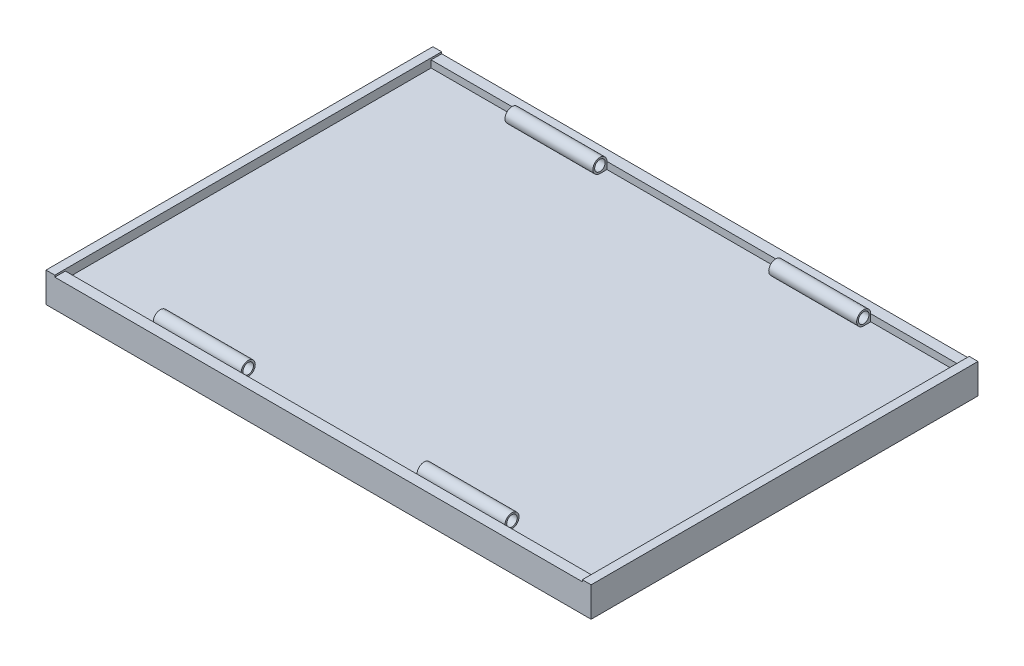
ISO-10303-21;
HEADER;
FILE_DESCRIPTION(('STEP AP214'),'2;1');
FILE_NAME('part.step','',(''),(''),'','','');
FILE_SCHEMA(('AUTOMOTIVE_DESIGN { 1 0 10303 214 1 1 1 1 }'));
ENDSEC;
DATA;
#1=APPLICATION_CONTEXT('core data for automotive mechanical design processes');
#2=APPLICATION_PROTOCOL_DEFINITION('international standard','automotive_design',2000,#1);
#3=PRODUCT_CONTEXT('',#1,'mechanical');
#4=PRODUCT('Part','Part','',(#3));
#5=PRODUCT_RELATED_PRODUCT_CATEGORY('part','',(#4));
#6=PRODUCT_DEFINITION_FORMATION('','',#4);
#7=PRODUCT_DEFINITION_CONTEXT('part definition',#1,'design');
#8=PRODUCT_DEFINITION('design','',#6,#7);
#9=PRODUCT_DEFINITION_SHAPE('','',#8);
#10=(LENGTH_UNIT() NAMED_UNIT(*) SI_UNIT(.MILLI.,.METRE.));
#11=(NAMED_UNIT(*) PLANE_ANGLE_UNIT() SI_UNIT($,.RADIAN.));
#12=(NAMED_UNIT(*) SI_UNIT($,.STERADIAN.) SOLID_ANGLE_UNIT());
#13=UNCERTAINTY_MEASURE_WITH_UNIT(LENGTH_MEASURE(1.E-05),#10,'distance_accuracy_value','');
#14=(GEOMETRIC_REPRESENTATION_CONTEXT(3) GLOBAL_UNCERTAINTY_ASSIGNED_CONTEXT((#13)) GLOBAL_UNIT_ASSIGNED_CONTEXT((#10,
#11,#12)) REPRESENTATION_CONTEXT('',''));
#15=CARTESIAN_POINT('',(0.,0.,0.));
#16=DIRECTION('',(0.,0.,1.));
#17=DIRECTION('',(1.,0.,0.));
#18=AXIS2_PLACEMENT_3D('',#15,#16,#17);
#19=CARTESIAN_POINT('',(0.,12.,0.));
#20=DIRECTION('',(0.,1.,0.));
#21=DIRECTION('',(0.,0.,1.));
#22=AXIS2_PLACEMENT_3D('',#19,#20,#21);
#23=PLANE('',#22);
#24=DIRECTION('',(1.,0.,0.));
#25=VECTOR('',#24,1.);
#26=CARTESIAN_POINT('',(150.660377358491,12.,81.1698113207547));
#27=LINE('',#26,#25);
#28=CARTESIAN_POINT('',(100.660377358491,12.,81.1698113207547));
#29=VERTEX_POINT('',#28);
#30=CARTESIAN_POINT('',(150.660377358491,12.,81.1698113207547));
#31=VERTEX_POINT('',#30);
#32=EDGE_CURVE('E286',#29,#31,#27,.T.);
#33=ORIENTED_EDGE('',*,*,#32,.T.);
#34=DIRECTION('',(0.,0.,-1.));
#35=VECTOR('',#34,1.);
#36=CARTESIAN_POINT('',(150.660377358491,12.,-126.830188679245));
#37=LINE('',#36,#35);
#38=CARTESIAN_POINT('',(150.660377358491,12.,-126.830188679245));
#39=VERTEX_POINT('',#38);
#40=EDGE_CURVE('E295',#31,#39,#37,.T.);
#41=ORIENTED_EDGE('',*,*,#40,.T.);
#42=DIRECTION('',(-1.,0.,0.));
#43=VECTOR('',#42,1.);
#44=CARTESIAN_POINT('',(150.660377358491,12.,-126.830188679245));
#45=LINE('',#44,#43);
#46=CARTESIAN_POINT('',(100.660377358491,12.,-126.830188679245));
#47=VERTEX_POINT('',#46);
#48=EDGE_CURVE('E298',#39,#47,#45,.T.);
#49=ORIENTED_EDGE('',*,*,#48,.T.);
#50=DIRECTION('',(0.,0.,1.));
#51=VECTOR('',#50,1.);
#52=CARTESIAN_POINT('',(100.660377358491,12.,-126.830188679245));
#53=LINE('',#52,#51);
#54=CARTESIAN_POINT('',(100.660377358491,12.,-122.830188679245));
#55=VERTEX_POINT('',#54);
#56=EDGE_CURVE('E301',#47,#55,#53,.T.);
#57=ORIENTED_EDGE('',*,*,#56,.T.);
#58=DIRECTION('',(1.,0.,0.));
#59=VECTOR('',#58,1.);
#60=CARTESIAN_POINT('',(-149.339622641509,12.,-122.830188679245));
#61=LINE('',#60,#59);
#62=CARTESIAN_POINT('',(50.6603773584905,12.,-122.830188679245));
#63=VERTEX_POINT('',#62);
#64=EDGE_CURVE('E321',#55,#63,#61,.F.);
#65=ORIENTED_EDGE('',*,*,#64,.T.);
#66=DIRECTION('',(0.,0.,-1.));
#67=VECTOR('',#66,1.);
#68=CARTESIAN_POINT('',(50.6603773584905,12.,-126.830188679245));
#69=LINE('',#68,#67);
#70=CARTESIAN_POINT('',(50.6603773584905,12.,-126.830188679245));
#71=VERTEX_POINT('',#70);
#72=EDGE_CURVE('E268',#63,#71,#69,.T.);
#73=ORIENTED_EDGE('',*,*,#72,.T.);
#74=DIRECTION('',(-1.,0.,0.));
#75=VECTOR('',#74,1.);
#76=CARTESIAN_POINT('',(-49.3396226415095,12.,-126.830188679245));
#77=LINE('',#76,#75);
#78=CARTESIAN_POINT('',(-49.3396226415095,12.,-126.830188679245));
#79=VERTEX_POINT('',#78);
#80=EDGE_CURVE('E271',#71,#79,#77,.T.);
#81=ORIENTED_EDGE('',*,*,#80,.T.);
#82=DIRECTION('',(0.,0.,1.));
#83=VECTOR('',#82,1.);
#84=CARTESIAN_POINT('',(-49.3396226415095,12.,-126.830188679245));
#85=LINE('',#84,#83);
#86=CARTESIAN_POINT('',(-49.3396226415095,12.,-122.830188679245));
#87=VERTEX_POINT('',#86);
#88=EDGE_CURVE('E265',#79,#87,#85,.T.);
#89=ORIENTED_EDGE('',*,*,#88,.T.);
#90=CARTESIAN_POINT('',(-99.3396226415095,12.,-122.830188679245));
#91=VERTEX_POINT('',#90);
#92=EDGE_CURVE('E57',#87,#91,#61,.F.);
#93=ORIENTED_EDGE('',*,*,#92,.T.);
#94=DIRECTION('',(0.,0.,-1.));
#95=VECTOR('',#94,1.);
#96=CARTESIAN_POINT('',(-99.3396226415095,12.,-126.830188679245));
#97=LINE('',#96,#95);
#98=CARTESIAN_POINT('',(-99.3396226415095,12.,-126.830188679245));
#99=VERTEX_POINT('',#98);
#100=EDGE_CURVE('E306',#91,#99,#97,.T.);
#101=ORIENTED_EDGE('',*,*,#100,.T.);
#102=DIRECTION('',(-1.,0.,0.));
#103=VECTOR('',#102,1.);
#104=CARTESIAN_POINT('',(-149.339622641509,12.,-126.830188679245));
#105=LINE('',#104,#103);
#106=CARTESIAN_POINT('',(-149.339622641509,12.,-126.830188679245));
#107=VERTEX_POINT('',#106);
#108=EDGE_CURVE('E309',#99,#107,#105,.T.);
#109=ORIENTED_EDGE('',*,*,#108,.T.);
#110=DIRECTION('',(0.,0.,1.));
#111=VECTOR('',#110,1.);
#112=CARTESIAN_POINT('',(-149.339622641509,12.,-126.830188679245));
#113=LINE('',#112,#111);
#114=CARTESIAN_POINT('',(-149.339622641509,12.,81.1698113207547));
#115=VERTEX_POINT('',#114);
#116=EDGE_CURVE('E304',#107,#115,#113,.T.);
#117=ORIENTED_EDGE('',*,*,#116,.T.);
#118=DIRECTION('',(1.,0.,0.));
#119=VECTOR('',#118,1.);
#120=CARTESIAN_POINT('',(-149.339622641509,12.,81.1698113207547));
#121=LINE('',#120,#119);
#122=CARTESIAN_POINT('',(-99.3396226415095,12.,81.1698113207547));
#123=VERTEX_POINT('',#122);
#124=EDGE_CURVE('E289',#115,#123,#121,.T.);
#125=ORIENTED_EDGE('',*,*,#124,.T.);
#126=DIRECTION('',(0.,0.,-1.));
#127=VECTOR('',#126,1.);
#128=CARTESIAN_POINT('',(-99.3396226415095,12.,73.1698113207547));
#129=LINE('',#128,#127);
#130=CARTESIAN_POINT('',(-99.3396226415095,12.,77.1698113207547));
#131=VERTEX_POINT('',#130);
#132=EDGE_CURVE('E292',#123,#131,#129,.T.);
#133=ORIENTED_EDGE('',*,*,#132,.T.);
#134=DIRECTION('',(-1.,0.,0.));
#135=VECTOR('',#134,1.);
#136=CARTESIAN_POINT('',(-154.339622641509,12.,77.1698113207547));
#137=LINE('',#136,#135);
#138=CARTESIAN_POINT('',(-49.3396226415095,12.,77.1698113207547));
#139=VERTEX_POINT('',#138);
#140=EDGE_CURVE('E362',#139,#131,#137,.T.);
#141=ORIENTED_EDGE('',*,*,#140,.F.);
#142=DIRECTION('',(0.,0.,1.));
#143=VECTOR('',#142,1.);
#144=CARTESIAN_POINT('',(-49.3396226415095,12.,73.1698113207547));
#145=LINE('',#144,#143);
#146=CARTESIAN_POINT('',(-49.3396226415095,12.,81.1698113207547));
#147=VERTEX_POINT('',#146);
#148=EDGE_CURVE('E274',#139,#147,#145,.T.);
#149=ORIENTED_EDGE('',*,*,#148,.T.);
#150=DIRECTION('',(1.,0.,0.));
#151=VECTOR('',#150,1.);
#152=CARTESIAN_POINT('',(-49.3396226415095,12.,81.1698113207547));
#153=LINE('',#152,#151);
#154=CARTESIAN_POINT('',(50.6603773584905,12.,81.1698113207547));
#155=VERTEX_POINT('',#154);
#156=EDGE_CURVE('E277',#147,#155,#153,.T.);
#157=ORIENTED_EDGE('',*,*,#156,.T.);
#158=DIRECTION('',(0.,0.,-1.));
#159=VECTOR('',#158,1.);
#160=CARTESIAN_POINT('',(50.6603773584905,12.,73.1698113207547));
#161=LINE('',#160,#159);
#162=CARTESIAN_POINT('',(50.6603773584905,12.,77.1698113207547));
#163=VERTEX_POINT('',#162);
#164=EDGE_CURVE('E280',#155,#163,#161,.T.);
#165=ORIENTED_EDGE('',*,*,#164,.T.);
#166=CARTESIAN_POINT('',(100.660377358491,12.,77.1698113207547));
#167=VERTEX_POINT('',#166);
#168=EDGE_CURVE('E359',#167,#163,#137,.T.);
#169=ORIENTED_EDGE('',*,*,#168,.F.);
#170=DIRECTION('',(0.,0.,1.));
#171=VECTOR('',#170,1.);
#172=CARTESIAN_POINT('',(100.660377358491,12.,73.1698113207547));
#173=LINE('',#172,#171);
#174=EDGE_CURVE('E283',#167,#29,#173,.T.);
#175=ORIENTED_EDGE('',*,*,#174,.T.);
#176=EDGE_LOOP('',(#33,#41,#49,#57,#65,#73,#81,#89,#93,#101,#109,#117,#125,#133,#141,#149,#157,
#165,#169,#175));
#177=FACE_BOUND('',#176,.T.);
#178=ADVANCED_FACE('F49',(#177),#23,.T.);
#179=CARTESIAN_POINT('',(0.,16.,0.));
#180=DIRECTION('',(0.,1.,0.));
#181=DIRECTION('',(0.,0.,1.));
#182=AXIS2_PLACEMENT_3D('',#179,#180,#181);
#183=PLANE('',#182);
#184=DIRECTION('',(1.,0.,0.));
#185=VECTOR('',#184,1.);
#186=CARTESIAN_POINT('',(-149.339622641509,16.,-126.830188679245));
#187=LINE('',#186,#185);
#188=CARTESIAN_POINT('',(150.660377358491,16.,-126.830188679245));
#189=VERTEX_POINT('',#188);
#190=CARTESIAN_POINT('',(100.660377358491,16.,-126.830188679245));
#191=VERTEX_POINT('',#190);
#192=EDGE_CURVE('E408',#189,#191,#187,.F.);
#193=ORIENTED_EDGE('',*,*,#192,.F.);
#194=DIRECTION('',(0.,0.,-1.));
#195=VECTOR('',#194,1.);
#196=CARTESIAN_POINT('',(150.660377358491,16.,0.));
#197=LINE('',#196,#195);
#198=CARTESIAN_POINT('',(150.660377358491,16.,-132.830188679245));
#199=VERTEX_POINT('',#198);
#200=EDGE_CURVE('E72',#189,#199,#197,.T.);
#201=ORIENTED_EDGE('',*,*,#200,.T.);
#202=DIRECTION('',(-1.,0.,0.));
#203=VECTOR('',#202,1.);
#204=CARTESIAN_POINT('',(-154.339622641509,16.,-132.830188679245));
#205=LINE('',#204,#203);
#206=CARTESIAN_POINT('',(-149.339622641509,16.,-132.830188679245));
#207=VERTEX_POINT('',#206);
#208=EDGE_CURVE('E423',#199,#207,#205,.T.);
#209=ORIENTED_EDGE('',*,*,#208,.T.);
#210=DIRECTION('',(0.,0.,1.));
#211=VECTOR('',#210,1.);
#212=CARTESIAN_POINT('',(-149.339622641509,16.,0.));
#213=LINE('',#212,#211);
#214=CARTESIAN_POINT('',(-149.339622641509,16.,-126.830188679245));
#215=VERTEX_POINT('',#214);
#216=EDGE_CURVE('E263',#207,#215,#213,.T.);
#217=ORIENTED_EDGE('',*,*,#216,.T.);
#218=CARTESIAN_POINT('',(-99.3396226415095,16.,-126.830188679245));
#219=VERTEX_POINT('',#218);
#220=EDGE_CURVE('E384',#219,#215,#187,.F.);
#221=ORIENTED_EDGE('',*,*,#220,.F.);
#222=CARTESIAN_POINT('',(-49.3396226415095,16.,-126.830188679245));
#223=VERTEX_POINT('',#222);
#224=EDGE_CURVE('E377',#223,#219,#187,.F.);
#225=ORIENTED_EDGE('',*,*,#224,.F.);
#226=CARTESIAN_POINT('',(50.6603773584905,16.,-126.830188679245));
#227=VERTEX_POINT('',#226);
#228=EDGE_CURVE('E402',#227,#223,#187,.F.);
#229=ORIENTED_EDGE('',*,*,#228,.F.);
#230=EDGE_CURVE('E403',#191,#227,#187,.F.);
#231=ORIENTED_EDGE('',*,*,#230,.F.);
#232=EDGE_LOOP('',(#193,#201,#209,#217,#221,#225,#229,#231));
#233=FACE_BOUND('',#232,.T.);
#234=ADVANCED_FACE('F477',(#233),#183,.T.);
#235=CARTESIAN_POINT('',(0.,16.,0.));
#236=DIRECTION('',(0.,-1.,0.));
#237=DIRECTION('',(0.,0.,-1.));
#238=AXIS2_PLACEMENT_3D('',#235,#236,#237);
#239=PLANE('',#238);
#240=DIRECTION('',(0.,0.,1.));
#241=VECTOR('',#240,1.);
#242=CARTESIAN_POINT('',(150.660377358491,16.,0.));
#243=LINE('',#242,#241);
#244=CARTESIAN_POINT('',(150.660377358491,16.,81.1698113207547));
#245=VERTEX_POINT('',#244);
#246=CARTESIAN_POINT('',(150.660377358491,16.,87.1698113207547));
#247=VERTEX_POINT('',#246);
#248=EDGE_CURVE('E245',#245,#247,#243,.T.);
#249=ORIENTED_EDGE('',*,*,#248,.F.);
#250=DIRECTION('',(1.,0.,0.));
#251=VECTOR('',#250,1.);
#252=CARTESIAN_POINT('',(-149.339622641509,16.,81.1698113207547));
#253=LINE('',#252,#251);
#254=CARTESIAN_POINT('',(100.660377358491,16.,81.1698113207547));
#255=VERTEX_POINT('',#254);
#256=EDGE_CURVE('E373',#245,#255,#253,.F.);
#257=ORIENTED_EDGE('',*,*,#256,.T.);
#258=CARTESIAN_POINT('',(50.6603773584905,16.,81.1698113207547));
#259=VERTEX_POINT('',#258);
#260=EDGE_CURVE('E376',#255,#259,#253,.F.);
#261=ORIENTED_EDGE('',*,*,#260,.T.);
#262=CARTESIAN_POINT('',(-49.3396226415095,16.,81.1698113207547));
#263=VERTEX_POINT('',#262);
#264=EDGE_CURVE('E443',#259,#263,#253,.F.);
#265=ORIENTED_EDGE('',*,*,#264,.T.);
#266=CARTESIAN_POINT('',(-99.3396226415095,16.,81.1698113207547));
#267=VERTEX_POINT('',#266);
#268=EDGE_CURVE('E440',#263,#267,#253,.F.);
#269=ORIENTED_EDGE('',*,*,#268,.T.);
#270=CARTESIAN_POINT('',(-149.339622641509,16.,81.1698113207547));
#271=VERTEX_POINT('',#270);
#272=EDGE_CURVE('E378',#267,#271,#253,.F.);
#273=ORIENTED_EDGE('',*,*,#272,.T.);
#274=DIRECTION('',(0.,0.,-1.));
#275=VECTOR('',#274,1.);
#276=CARTESIAN_POINT('',(-149.339622641509,16.,0.));
#277=LINE('',#276,#275);
#278=CARTESIAN_POINT('',(-149.339622641509,16.,87.1698113207547));
#279=VERTEX_POINT('',#278);
#280=EDGE_CURVE('E12',#279,#271,#277,.T.);
#281=ORIENTED_EDGE('',*,*,#280,.F.);
#282=DIRECTION('',(1.,0.,0.));
#283=VECTOR('',#282,1.);
#284=CARTESIAN_POINT('',(-154.339622641509,16.,87.1698113207547));
#285=LINE('',#284,#283);
#286=EDGE_CURVE('E64',#279,#247,#285,.T.);
#287=ORIENTED_EDGE('',*,*,#286,.T.);
#288=EDGE_LOOP('',(#249,#257,#261,#265,#269,#273,#281,#287));
#289=FACE_BOUND('',#288,.T.);
#290=ADVANCED_FACE('F449',(#289),#239,.F.);
#291=CARTESIAN_POINT('',(100.660377358491,-0.00999999999999959,73.1698113207547));
#292=DIRECTION('',(-1.,0.,0.));
#293=DIRECTION('',(0.,0.,1.));
#294=AXIS2_PLACEMENT_3D('',#291,#292,#293);
#295=PLANE('',#294);
#296=CARTESIAN_POINT('',(100.660377358491,16.,77.1698113207547));
#297=DIRECTION('',(-1.,0.,0.));
#298=DIRECTION('',(0.,0.,1.));
#299=AXIS2_PLACEMENT_3D('',#296,#297,#298);
#300=CIRCLE('',#299,2.99999999999998);
#301=CARTESIAN_POINT('',(100.660377358491,16.,80.1698113207547));
#302=VERTEX_POINT('',#301);
#303=EDGE_CURVE('E340',#302,#302,#300,.T.);
#304=ORIENTED_EDGE('',*,*,#303,.T.);
#305=EDGE_LOOP('',(#304));
#306=FACE_BOUND('',#305,.T.);
#307=ORIENTED_EDGE('',*,*,#174,.F.);
#308=CARTESIAN_POINT('',(100.660377358491,16.,77.1698113207547));
#309=DIRECTION('',(-1.,0.,0.));
#310=DIRECTION('',(0.,0.,1.));
#311=AXIS2_PLACEMENT_3D('',#308,#309,#310);
#312=CIRCLE('',#311,3.99999999999998);
#313=EDGE_CURVE('E343',#255,#167,#312,.T.);
#314=ORIENTED_EDGE('',*,*,#313,.F.);
#315=DIRECTION('',(0.,1.,0.));
#316=VECTOR('',#315,1.);
#317=CARTESIAN_POINT('',(100.660377358491,-0.00999999999999959,81.1698113207547));
#318=LINE('',#317,#316);
#319=EDGE_CURVE('E344',#29,#255,#318,.T.);
#320=ORIENTED_EDGE('',*,*,#319,.F.);
#321=EDGE_LOOP('',(#307,#314,#320));
#322=FACE_BOUND('',#321,.T.);
#323=ADVANCED_FACE('F558',(#306,#322),#295,.F.);
#324=CARTESIAN_POINT('',(150.660377358491,-0.00999999999999959,81.1698113207547));
#325=DIRECTION('',(0.,0.,1.));
#326=DIRECTION('',(1.,0.,0.));
#327=AXIS2_PLACEMENT_3D('',#324,#325,#326);
#328=PLANE('',#327);
#329=ORIENTED_EDGE('',*,*,#32,.F.);
#330=ORIENTED_EDGE('',*,*,#319,.T.);
#331=ORIENTED_EDGE('',*,*,#256,.F.);
#332=DIRECTION('',(0.,1.,0.));
#333=VECTOR('',#332,1.);
#334=CARTESIAN_POINT('',(150.660377358491,-0.00999999999999959,81.1698113207547));
#335=LINE('',#334,#333);
#336=EDGE_CURVE('E332',#31,#245,#335,.T.);
#337=ORIENTED_EDGE('',*,*,#336,.F.);
#338=EDGE_LOOP('',(#329,#330,#331,#337));
#339=FACE_BOUND('',#338,.T.);
#340=ADVANCED_FACE('F563',(#339),#328,.F.);
#341=CARTESIAN_POINT('',(150.660377358491,-0.00999999999999959,-126.830188679245));
#342=DIRECTION('',(1.,0.,0.));
#343=DIRECTION('',(0.,0.,-1.));
#344=AXIS2_PLACEMENT_3D('',#341,#342,#343);
#345=PLANE('',#344);
#346=ORIENTED_EDGE('',*,*,#336,.T.);
#347=ORIENTED_EDGE('',*,*,#248,.T.);
#348=DIRECTION('',(0.,-1.,0.));
#349=VECTOR('',#348,1.);
#350=CARTESIAN_POINT('',(150.660377358491,17.,87.1698113207547));
#351=LINE('',#350,#349);
#352=CARTESIAN_POINT('',(150.660377358491,17.,87.1698113207547));
#353=VERTEX_POINT('',#352);
#354=EDGE_CURVE('E241',#353,#247,#351,.T.);
#355=ORIENTED_EDGE('',*,*,#354,.F.);
#356=DIRECTION('',(0.,0.,1.));
#357=VECTOR('',#356,1.);
#358=CARTESIAN_POINT('',(150.660377358491,17.,-132.830188679245));
#359=LINE('',#358,#357);
#360=CARTESIAN_POINT('',(150.660377358491,17.,-132.830188679245));
#361=VERTEX_POINT('',#360);
#362=EDGE_CURVE('E231',#361,#353,#359,.T.);
#363=ORIENTED_EDGE('',*,*,#362,.F.);
#364=DIRECTION('',(0.,-1.,0.));
#365=VECTOR('',#364,1.);
#366=CARTESIAN_POINT('',(150.660377358491,17.,-132.830188679245));
#367=LINE('',#366,#365);
#368=EDGE_CURVE('E228',#361,#199,#367,.T.);
#369=ORIENTED_EDGE('',*,*,#368,.T.);
#370=ORIENTED_EDGE('',*,*,#200,.F.);
#371=DIRECTION('',(0.,1.,0.));
#372=VECTOR('',#371,1.);
#373=CARTESIAN_POINT('',(150.660377358491,-0.00999999999999959,-126.830188679245));
#374=LINE('',#373,#372);
#375=EDGE_CURVE('E386',#39,#189,#374,.T.);
#376=ORIENTED_EDGE('',*,*,#375,.F.);
#377=ORIENTED_EDGE('',*,*,#40,.F.);
#378=EDGE_LOOP('',(#346,#347,#355,#363,#369,#370,#376,#377));
#379=FACE_BOUND('',#378,.T.);
#380=ADVANCED_FACE('F559',(#379),#345,.F.);
#381=CARTESIAN_POINT('',(100.660377358491,-0.00999999999999959,-126.830188679245));
#382=DIRECTION('',(-1.,0.,0.));
#383=DIRECTION('',(0.,0.,1.));
#384=AXIS2_PLACEMENT_3D('',#381,#382,#383);
#385=PLANE('',#384);
#386=CARTESIAN_POINT('',(100.660377358491,16.,-122.830188679245));
#387=DIRECTION('',(-1.,0.,0.));
#388=DIRECTION('',(0.,0.,1.));
#389=AXIS2_PLACEMENT_3D('',#386,#387,#388);
#390=CIRCLE('',#389,3.00000000000001);
#391=CARTESIAN_POINT('',(100.660377358491,16.,-119.830188679245));
#392=VERTEX_POINT('',#391);
#393=EDGE_CURVE('E381',#392,#392,#390,.T.);
#394=ORIENTED_EDGE('',*,*,#393,.T.);
#395=EDGE_LOOP('',(#394));
#396=FACE_BOUND('',#395,.T.);
#397=ORIENTED_EDGE('',*,*,#56,.F.);
#398=DIRECTION('',(0.,1.,0.));
#399=VECTOR('',#398,1.);
#400=CARTESIAN_POINT('',(100.660377358491,-0.00999999999999959,-126.830188679245));
#401=LINE('',#400,#399);
#402=EDGE_CURVE('E335',#47,#191,#401,.T.);
#403=ORIENTED_EDGE('',*,*,#402,.T.);
#404=CARTESIAN_POINT('',(100.660377358491,16.,-122.830188679245));
#405=DIRECTION('',(-1.,0.,0.));
#406=DIRECTION('',(0.,0.,1.));
#407=AXIS2_PLACEMENT_3D('',#404,#405,#406);
#408=CIRCLE('',#407,4.00000000000001);
#409=EDGE_CURVE('E316',#55,#191,#408,.T.);
#410=ORIENTED_EDGE('',*,*,#409,.F.);
#411=EDGE_LOOP('',(#397,#403,#410));
#412=FACE_BOUND('',#411,.T.);
#413=ADVANCED_FACE('F562',(#396,#412),#385,.F.);
#414=CARTESIAN_POINT('',(150.660377358491,-0.00999999999999959,-126.830188679245));
#415=DIRECTION('',(0.,0.,-1.));
#416=DIRECTION('',(-1.,0.,0.));
#417=AXIS2_PLACEMENT_3D('',#414,#415,#416);
#418=PLANE('',#417);
#419=ORIENTED_EDGE('',*,*,#48,.F.);
#420=ORIENTED_EDGE('',*,*,#375,.T.);
#421=ORIENTED_EDGE('',*,*,#192,.T.);
#422=ORIENTED_EDGE('',*,*,#402,.F.);
#423=EDGE_LOOP('',(#419,#420,#421,#422));
#424=FACE_BOUND('',#423,.T.);
#425=ADVANCED_FACE('F541',(#424),#418,.F.);
#426=CARTESIAN_POINT('',(-99.3396226415095,-0.00999999999999959,-126.830188679245));
#427=DIRECTION('',(1.,0.,0.));
#428=DIRECTION('',(0.,0.,-1.));
#429=AXIS2_PLACEMENT_3D('',#426,#427,#428);
#430=PLANE('',#429);
#431=CARTESIAN_POINT('',(-99.3396226415095,16.,-122.830188679245));
#432=DIRECTION('',(1.,0.,0.));
#433=DIRECTION('',(0.,0.,-1.));
#434=AXIS2_PLACEMENT_3D('',#431,#432,#433);
#435=CIRCLE('',#434,3.00000000000001);
#436=CARTESIAN_POINT('',(-99.3396226415095,16.,-125.830188679245));
#437=VERTEX_POINT('',#436);
#438=EDGE_CURVE('E366',#437,#437,#435,.T.);
#439=ORIENTED_EDGE('',*,*,#438,.T.);
#440=EDGE_LOOP('',(#439));
#441=FACE_BOUND('',#440,.T.);
#442=DIRECTION('',(0.,1.,0.));
#443=VECTOR('',#442,1.);
#444=CARTESIAN_POINT('',(-99.3396226415095,-0.00999999999999959,-126.830188679245));
#445=LINE('',#444,#443);
#446=EDGE_CURVE('E385',#99,#219,#445,.T.);
#447=ORIENTED_EDGE('',*,*,#446,.F.);
#448=ORIENTED_EDGE('',*,*,#100,.F.);
#449=CARTESIAN_POINT('',(-99.3396226415095,16.,-122.830188679245));
#450=DIRECTION('',(1.,0.,0.));
#451=DIRECTION('',(0.,0.,-1.));
#452=AXIS2_PLACEMENT_3D('',#449,#450,#451);
#453=CIRCLE('',#452,4.00000000000001);
#454=EDGE_CURVE('E313',#219,#91,#453,.T.);
#455=ORIENTED_EDGE('',*,*,#454,.F.);
#456=EDGE_LOOP('',(#447,#448,#455));
#457=FACE_BOUND('',#456,.T.);
#458=ADVANCED_FACE('F537',(#441,#457),#430,.F.);
#459=CARTESIAN_POINT('',(-149.339622641509,-0.00999999999999959,-126.830188679245));
#460=DIRECTION('',(0.,0.,-1.));
#461=DIRECTION('',(-1.,0.,0.));
#462=AXIS2_PLACEMENT_3D('',#459,#460,#461);
#463=PLANE('',#462);
#464=DIRECTION('',(0.,1.,0.));
#465=VECTOR('',#464,1.);
#466=CARTESIAN_POINT('',(-149.339622641509,-0.00999999999999959,-126.830188679245));
#467=LINE('',#466,#465);
#468=EDGE_CURVE('E382',#107,#215,#467,.T.);
#469=ORIENTED_EDGE('',*,*,#468,.F.);
#470=ORIENTED_EDGE('',*,*,#108,.F.);
#471=ORIENTED_EDGE('',*,*,#446,.T.);
#472=ORIENTED_EDGE('',*,*,#220,.T.);
#473=EDGE_LOOP('',(#469,#470,#471,#472));
#474=FACE_BOUND('',#473,.T.);
#475=ADVANCED_FACE('F540',(#474),#463,.F.);
#476=CARTESIAN_POINT('',(-49.3396226415095,-0.00999999999999959,-126.830188679245));
#477=DIRECTION('',(-1.,0.,0.));
#478=DIRECTION('',(0.,0.,1.));
#479=AXIS2_PLACEMENT_3D('',#476,#477,#478);
#480=PLANE('',#479);
#481=CARTESIAN_POINT('',(-49.3396226415095,16.,-122.830188679245));
#482=DIRECTION('',(-1.,0.,0.));
#483=DIRECTION('',(0.,0.,1.));
#484=AXIS2_PLACEMENT_3D('',#481,#482,#483);
#485=CIRCLE('',#484,3.00000000000001);
#486=CARTESIAN_POINT('',(-49.3396226415095,16.,-119.830188679245));
#487=VERTEX_POINT('',#486);
#488=EDGE_CURVE('E407',#487,#487,#485,.T.);
#489=ORIENTED_EDGE('',*,*,#488,.T.);
#490=EDGE_LOOP('',(#489));
#491=FACE_BOUND('',#490,.T.);
#492=CARTESIAN_POINT('',(-49.3396226415095,16.,-122.830188679245));
#493=DIRECTION('',(-1.,0.,0.));
#494=DIRECTION('',(0.,0.,1.));
#495=AXIS2_PLACEMENT_3D('',#492,#493,#494);
#496=CIRCLE('',#495,4.00000000000001);
#497=EDGE_CURVE('E410',#87,#223,#496,.T.);
#498=ORIENTED_EDGE('',*,*,#497,.F.);
#499=ORIENTED_EDGE('',*,*,#88,.F.);
#500=DIRECTION('',(0.,1.,0.));
#501=VECTOR('',#500,1.);
#502=CARTESIAN_POINT('',(-49.3396226415095,-0.00999999999999959,-126.830188679245));
#503=LINE('',#502,#501);
#504=EDGE_CURVE('E357',#79,#223,#503,.T.);
#505=ORIENTED_EDGE('',*,*,#504,.T.);
#506=EDGE_LOOP('',(#498,#499,#505));
#507=FACE_BOUND('',#506,.T.);
#508=ADVANCED_FACE('F485',(#491,#507),#480,.F.);
#509=CARTESIAN_POINT('',(50.6603773584905,-0.00999999999999959,-126.830188679245));
#510=DIRECTION('',(1.,0.,0.));
#511=DIRECTION('',(0.,0.,-1.));
#512=AXIS2_PLACEMENT_3D('',#509,#510,#511);
#513=PLANE('',#512);
#514=CARTESIAN_POINT('',(50.6603773584905,16.,-122.830188679245));
#515=DIRECTION('',(1.,0.,0.));
#516=DIRECTION('',(0.,0.,-1.));
#517=AXIS2_PLACEMENT_3D('',#514,#515,#516);
#518=CIRCLE('',#517,3.00000000000001);
#519=CARTESIAN_POINT('',(50.6603773584905,16.,-125.830188679245));
#520=VERTEX_POINT('',#519);
#521=EDGE_CURVE('E404',#520,#520,#518,.T.);
#522=ORIENTED_EDGE('',*,*,#521,.T.);
#523=EDGE_LOOP('',(#522));
#524=FACE_BOUND('',#523,.T.);
#525=DIRECTION('',(0.,1.,0.));
#526=VECTOR('',#525,1.);
#527=CARTESIAN_POINT('',(50.6603773584905,-0.00999999999999959,-126.830188679245));
#528=LINE('',#527,#526);
#529=EDGE_CURVE('E312',#71,#227,#528,.T.);
#530=ORIENTED_EDGE('',*,*,#529,.F.);
#531=ORIENTED_EDGE('',*,*,#72,.F.);
#532=CARTESIAN_POINT('',(50.6603773584905,16.,-122.830188679245));
#533=DIRECTION('',(1.,0.,0.));
#534=DIRECTION('',(0.,0.,-1.));
#535=AXIS2_PLACEMENT_3D('',#532,#533,#534);
#536=CIRCLE('',#535,4.00000000000001);
#537=EDGE_CURVE('E326',#227,#63,#536,.T.);
#538=ORIENTED_EDGE('',*,*,#537,.F.);
#539=EDGE_LOOP('',(#530,#531,#538));
#540=FACE_BOUND('',#539,.T.);
#541=ADVANCED_FACE('F475',(#524,#540),#513,.F.);
#542=CARTESIAN_POINT('',(-49.3396226415095,-0.00999999999999959,-126.830188679245));
#543=DIRECTION('',(0.,0.,-1.));
#544=DIRECTION('',(-1.,0.,0.));
#545=AXIS2_PLACEMENT_3D('',#542,#543,#544);
#546=PLANE('',#545);
#547=ORIENTED_EDGE('',*,*,#504,.F.);
#548=ORIENTED_EDGE('',*,*,#80,.F.);
#549=ORIENTED_EDGE('',*,*,#529,.T.);
#550=ORIENTED_EDGE('',*,*,#228,.T.);
#551=EDGE_LOOP('',(#547,#548,#549,#550));
#552=FACE_BOUND('',#551,.T.);
#553=ADVANCED_FACE('F486',(#552),#546,.F.);
#554=CARTESIAN_POINT('',(-149.339622641509,-0.00999999999999959,73.1698113207547));
#555=DIRECTION('',(-1.,0.,0.));
#556=DIRECTION('',(0.,0.,1.));
#557=AXIS2_PLACEMENT_3D('',#554,#555,#556);
#558=PLANE('',#557);
#559=DIRECTION('',(0.,1.,0.));
#560=VECTOR('',#559,1.);
#561=CARTESIAN_POINT('',(-149.339622641509,-0.00999999999999959,81.1698113207547));
#562=LINE('',#561,#560);
#563=EDGE_CURVE('E331',#115,#271,#562,.T.);
#564=ORIENTED_EDGE('',*,*,#563,.F.);
#565=ORIENTED_EDGE('',*,*,#116,.F.);
#566=ORIENTED_EDGE('',*,*,#468,.T.);
#567=ORIENTED_EDGE('',*,*,#216,.F.);
#568=DIRECTION('',(0.,-1.,0.));
#569=VECTOR('',#568,1.);
#570=CARTESIAN_POINT('',(-149.339622641509,17.,-132.830188679245));
#571=LINE('',#570,#569);
#572=CARTESIAN_POINT('',(-149.339622641509,17.,-132.830188679245));
#573=VERTEX_POINT('',#572);
#574=EDGE_CURVE('E258',#573,#207,#571,.T.);
#575=ORIENTED_EDGE('',*,*,#574,.F.);
#576=DIRECTION('',(0.,0.,-1.));
#577=VECTOR('',#576,1.);
#578=CARTESIAN_POINT('',(-149.339622641509,17.,-132.830188679245));
#579=LINE('',#578,#577);
#580=CARTESIAN_POINT('',(-149.339622641509,17.,87.1698113207547));
#581=VERTEX_POINT('',#580);
#582=EDGE_CURVE('E253',#581,#573,#579,.T.);
#583=ORIENTED_EDGE('',*,*,#582,.F.);
#584=DIRECTION('',(0.,-1.,0.));
#585=VECTOR('',#584,1.);
#586=CARTESIAN_POINT('',(-149.339622641509,17.,87.1698113207547));
#587=LINE('',#586,#585);
#588=EDGE_CURVE('E261',#581,#279,#587,.T.);
#589=ORIENTED_EDGE('',*,*,#588,.T.);
#590=ORIENTED_EDGE('',*,*,#280,.T.);
#591=EDGE_LOOP('',(#564,#565,#566,#567,#575,#583,#589,#590));
#592=FACE_BOUND('',#591,.T.);
#593=ADVANCED_FACE('F488',(#592),#558,.F.);
#594=CARTESIAN_POINT('',(-99.3396226415095,-0.00999999999999959,73.1698113207547));
#595=DIRECTION('',(1.,0.,0.));
#596=DIRECTION('',(0.,0.,-1.));
#597=AXIS2_PLACEMENT_3D('',#594,#595,#596);
#598=PLANE('',#597);
#599=CARTESIAN_POINT('',(-99.3396226415095,16.,77.1698113207547));
#600=DIRECTION('',(1.,0.,0.));
#601=DIRECTION('',(0.,0.,-1.));
#602=AXIS2_PLACEMENT_3D('',#599,#600,#601);
#603=CIRCLE('',#602,2.99999999999998);
#604=CARTESIAN_POINT('',(-99.3396226415095,16.,74.1698113207547));
#605=VERTEX_POINT('',#604);
#606=EDGE_CURVE('E336',#605,#605,#603,.T.);
#607=ORIENTED_EDGE('',*,*,#606,.T.);
#608=EDGE_LOOP('',(#607));
#609=FACE_BOUND('',#608,.T.);
#610=CARTESIAN_POINT('',(-99.3396226415095,16.,77.1698113207547));
#611=DIRECTION('',(1.,0.,0.));
#612=DIRECTION('',(0.,0.,-1.));
#613=AXIS2_PLACEMENT_3D('',#610,#611,#612);
#614=CIRCLE('',#613,3.99999999999998);
#615=EDGE_CURVE('E339',#131,#267,#614,.T.);
#616=ORIENTED_EDGE('',*,*,#615,.F.);
#617=ORIENTED_EDGE('',*,*,#132,.F.);
#618=DIRECTION('',(0.,1.,0.));
#619=VECTOR('',#618,1.);
#620=CARTESIAN_POINT('',(-99.3396226415095,-0.00999999999999959,81.1698113207547));
#621=LINE('',#620,#619);
#622=EDGE_CURVE('E328',#123,#267,#621,.T.);
#623=ORIENTED_EDGE('',*,*,#622,.T.);
#624=EDGE_LOOP('',(#616,#617,#623));
#625=FACE_BOUND('',#624,.T.);
#626=ADVANCED_FACE('F495',(#609,#625),#598,.F.);
#627=CARTESIAN_POINT('',(-149.339622641509,-0.00999999999999959,81.1698113207547));
#628=DIRECTION('',(0.,0.,1.));
#629=DIRECTION('',(1.,0.,0.));
#630=AXIS2_PLACEMENT_3D('',#627,#628,#629);
#631=PLANE('',#630);
#632=ORIENTED_EDGE('',*,*,#622,.F.);
#633=ORIENTED_EDGE('',*,*,#124,.F.);
#634=ORIENTED_EDGE('',*,*,#563,.T.);
#635=ORIENTED_EDGE('',*,*,#272,.F.);
#636=EDGE_LOOP('',(#632,#633,#634,#635));
#637=FACE_BOUND('',#636,.T.);
#638=ADVANCED_FACE('F589',(#637),#631,.F.);
#639=CARTESIAN_POINT('',(-49.3396226415095,-0.00999999999999959,73.1698113207547));
#640=DIRECTION('',(-1.,0.,0.));
#641=DIRECTION('',(0.,0.,1.));
#642=AXIS2_PLACEMENT_3D('',#639,#640,#641);
#643=PLANE('',#642);
#644=CARTESIAN_POINT('',(-49.3396226415095,16.,77.1698113207547));
#645=DIRECTION('',(-1.,0.,0.));
#646=DIRECTION('',(0.,0.,1.));
#647=AXIS2_PLACEMENT_3D('',#644,#645,#646);
#648=CIRCLE('',#647,2.99999999999998);
#649=CARTESIAN_POINT('',(-49.3396226415095,16.,80.1698113207547));
#650=VERTEX_POINT('',#649);
#651=EDGE_CURVE('E351',#650,#650,#648,.T.);
#652=ORIENTED_EDGE('',*,*,#651,.T.);
#653=EDGE_LOOP('',(#652));
#654=FACE_BOUND('',#653,.T.);
#655=DIRECTION('',(0.,1.,0.));
#656=VECTOR('',#655,1.);
#657=CARTESIAN_POINT('',(-49.3396226415095,-0.00999999999999959,81.1698113207547));
#658=LINE('',#657,#656);
#659=EDGE_CURVE('E346',#147,#263,#658,.T.);
#660=ORIENTED_EDGE('',*,*,#659,.F.);
#661=ORIENTED_EDGE('',*,*,#148,.F.);
#662=CARTESIAN_POINT('',(-49.3396226415095,16.,77.1698113207547));
#663=DIRECTION('',(-1.,0.,0.));
#664=DIRECTION('',(0.,0.,1.));
#665=AXIS2_PLACEMENT_3D('',#662,#663,#664);
#666=CIRCLE('',#665,3.99999999999998);
#667=EDGE_CURVE('E354',#263,#139,#666,.T.);
#668=ORIENTED_EDGE('',*,*,#667,.F.);
#669=EDGE_LOOP('',(#660,#661,#668));
#670=FACE_BOUND('',#669,.T.);
#671=ADVANCED_FACE('F462',(#654,#670),#643,.F.);
#672=CARTESIAN_POINT('',(50.6603773584905,-0.00999999999999959,73.1698113207547));
#673=DIRECTION('',(1.,0.,0.));
#674=DIRECTION('',(0.,0.,-1.));
#675=AXIS2_PLACEMENT_3D('',#672,#673,#674);
#676=PLANE('',#675);
#677=CARTESIAN_POINT('',(50.6603773584905,16.,77.1698113207547));
#678=DIRECTION('',(1.,0.,0.));
#679=DIRECTION('',(0.,0.,-1.));
#680=AXIS2_PLACEMENT_3D('',#677,#678,#679);
#681=CIRCLE('',#680,2.99999999999998);
#682=CARTESIAN_POINT('',(50.6603773584905,16.,74.1698113207547));
#683=VERTEX_POINT('',#682);
#684=EDGE_CURVE('E363',#683,#683,#681,.T.);
#685=ORIENTED_EDGE('',*,*,#684,.T.);
#686=EDGE_LOOP('',(#685));
#687=FACE_BOUND('',#686,.T.);
#688=CARTESIAN_POINT('',(50.6603773584905,16.,77.1698113207547));
#689=DIRECTION('',(1.,0.,0.));
#690=DIRECTION('',(0.,0.,-1.));
#691=AXIS2_PLACEMENT_3D('',#688,#689,#690);
#692=CIRCLE('',#691,3.99999999999998);
#693=EDGE_CURVE('E317',#163,#259,#692,.T.);
#694=ORIENTED_EDGE('',*,*,#693,.F.);
#695=ORIENTED_EDGE('',*,*,#164,.F.);
#696=DIRECTION('',(0.,1.,0.));
#697=VECTOR('',#696,1.);
#698=CARTESIAN_POINT('',(50.6603773584905,-0.00999999999999959,81.1698113207547));
#699=LINE('',#698,#697);
#700=EDGE_CURVE('E355',#155,#259,#699,.T.);
#701=ORIENTED_EDGE('',*,*,#700,.T.);
#702=EDGE_LOOP('',(#694,#695,#701));
#703=FACE_BOUND('',#702,.T.);
#704=ADVANCED_FACE('F523',(#687,#703),#676,.F.);
#705=CARTESIAN_POINT('',(-49.3396226415095,-0.00999999999999959,81.1698113207547));
#706=DIRECTION('',(0.,0.,1.));
#707=DIRECTION('',(1.,0.,0.));
#708=AXIS2_PLACEMENT_3D('',#705,#706,#707);
#709=PLANE('',#708);
#710=ORIENTED_EDGE('',*,*,#700,.F.);
#711=ORIENTED_EDGE('',*,*,#156,.F.);
#712=ORIENTED_EDGE('',*,*,#659,.T.);
#713=ORIENTED_EDGE('',*,*,#264,.F.);
#714=EDGE_LOOP('',(#710,#711,#712,#713));
#715=FACE_BOUND('',#714,.T.);
#716=ADVANCED_FACE('F458',(#715),#709,.F.);
#717=CARTESIAN_POINT('',(150.660377358491,16.,77.1698113207547));
#718=DIRECTION('',(-1.,0.,0.));
#719=DIRECTION('',(0.,0.,1.));
#720=AXIS2_PLACEMENT_3D('',#717,#718,#719);
#721=CYLINDRICAL_SURFACE('',#720,2.99999999999998);
#722=ORIENTED_EDGE('',*,*,#303,.F.);
#723=EDGE_LOOP('',(#722));
#724=FACE_BOUND('',#723,.T.);
#725=ORIENTED_EDGE('',*,*,#684,.F.);
#726=EDGE_LOOP('',(#725));
#727=FACE_BOUND('',#726,.T.);
#728=ADVANCED_FACE('F512',(#724,#727),#721,.F.);
#729=ORIENTED_EDGE('',*,*,#606,.F.);
#730=EDGE_LOOP('',(#729));
#731=FACE_BOUND('',#730,.T.);
#732=ORIENTED_EDGE('',*,*,#651,.F.);
#733=EDGE_LOOP('',(#732));
#734=FACE_BOUND('',#733,.T.);
#735=ADVANCED_FACE('F514',(#731,#734),#721,.F.);
#736=CARTESIAN_POINT('',(150.660377358491,16.,-122.830188679245));
#737=DIRECTION('',(-1.,0.,0.));
#738=DIRECTION('',(0.,0.,1.));
#739=AXIS2_PLACEMENT_3D('',#736,#737,#738);
#740=CYLINDRICAL_SURFACE('',#739,3.00000000000001);
#741=ORIENTED_EDGE('',*,*,#393,.F.);
#742=EDGE_LOOP('',(#741));
#743=FACE_BOUND('',#742,.T.);
#744=ORIENTED_EDGE('',*,*,#521,.F.);
#745=EDGE_LOOP('',(#744));
#746=FACE_BOUND('',#745,.T.);
#747=ADVANCED_FACE('F521',(#743,#746),#740,.F.);
#748=ORIENTED_EDGE('',*,*,#438,.F.);
#749=EDGE_LOOP('',(#748));
#750=FACE_BOUND('',#749,.T.);
#751=ORIENTED_EDGE('',*,*,#488,.F.);
#752=EDGE_LOOP('',(#751));
#753=FACE_BOUND('',#752,.T.);
#754=ADVANCED_FACE('F552',(#750,#753),#740,.F.);
#755=CARTESIAN_POINT('',(-154.339622641509,12.,87.1698113207547));
#756=DIRECTION('',(0.,0.,-1.));
#757=DIRECTION('',(-1.,0.,0.));
#758=AXIS2_PLACEMENT_3D('',#755,#756,#757);
#759=PLANE('',#758);
#760=DIRECTION('',(0.,-1.,0.));
#761=VECTOR('',#760,1.);
#762=CARTESIAN_POINT('',(155.660377358491,12.,87.1698113207547));
#763=LINE('',#762,#761);
#764=CARTESIAN_POINT('',(155.660377358491,17.,87.1698113207547));
#765=VERTEX_POINT('',#764);
#766=CARTESIAN_POINT('',(155.660377358491,0.,87.1698113207547));
#767=VERTEX_POINT('',#766);
#768=EDGE_CURVE('E222',#765,#767,#763,.T.);
#769=ORIENTED_EDGE('',*,*,#768,.F.);
#770=DIRECTION('',(1.,0.,0.));
#771=VECTOR('',#770,1.);
#772=CARTESIAN_POINT('',(155.660377358491,17.,87.1698113207547));
#773=LINE('',#772,#771);
#774=EDGE_CURVE('E236',#353,#765,#773,.T.);
#775=ORIENTED_EDGE('',*,*,#774,.F.);
#776=ORIENTED_EDGE('',*,*,#354,.T.);
#777=ORIENTED_EDGE('',*,*,#286,.F.);
#778=ORIENTED_EDGE('',*,*,#588,.F.);
#779=DIRECTION('',(1.,0.,0.));
#780=VECTOR('',#779,1.);
#781=CARTESIAN_POINT('',(-154.339622641509,17.,87.1698113207547));
#782=LINE('',#781,#780);
#783=CARTESIAN_POINT('',(-154.339622641509,17.,87.1698113207547));
#784=VERTEX_POINT('',#783);
#785=EDGE_CURVE('E251',#784,#581,#782,.T.);
#786=ORIENTED_EDGE('',*,*,#785,.F.);
#787=DIRECTION('',(0.,-1.,0.));
#788=VECTOR('',#787,1.);
#789=CARTESIAN_POINT('',(-154.339622641509,12.,87.1698113207547));
#790=LINE('',#789,#788);
#791=CARTESIAN_POINT('',(-154.339622641509,0.,87.1698113207547));
#792=VERTEX_POINT('',#791);
#793=EDGE_CURVE('E435',#784,#792,#790,.T.);
#794=ORIENTED_EDGE('',*,*,#793,.T.);
#795=DIRECTION('',(1.,0.,0.));
#796=VECTOR('',#795,1.);
#797=CARTESIAN_POINT('',(-154.339622641509,0.,87.1698113207547));
#798=LINE('',#797,#796);
#799=EDGE_CURVE('E428',#792,#767,#798,.T.);
#800=ORIENTED_EDGE('',*,*,#799,.T.);
#801=EDGE_LOOP('',(#769,#775,#776,#777,#778,#786,#794,#800));
#802=FACE_BOUND('',#801,.T.);
#803=ADVANCED_FACE('F549',(#802),#759,.F.);
#804=CARTESIAN_POINT('',(150.660377358491,16.,77.1698113207547));
#805=DIRECTION('',(-1.,0.,0.));
#806=DIRECTION('',(0.,0.,1.));
#807=AXIS2_PLACEMENT_3D('',#804,#805,#806);
#808=CYLINDRICAL_SURFACE('',#807,3.99999999999998);
#809=ORIENTED_EDGE('',*,*,#615,.T.);
#810=ORIENTED_EDGE('',*,*,#268,.F.);
#811=ORIENTED_EDGE('',*,*,#667,.T.);
#812=ORIENTED_EDGE('',*,*,#140,.T.);
#813=EDGE_LOOP('',(#809,#810,#811,#812));
#814=FACE_BOUND('',#813,.T.);
#815=ADVANCED_FACE('F466',(#814),#808,.T.);
#816=CARTESIAN_POINT('',(150.660377358491,16.,-122.830188679245));
#817=DIRECTION('',(-1.,0.,0.));
#818=DIRECTION('',(0.,0.,1.));
#819=AXIS2_PLACEMENT_3D('',#816,#817,#818);
#820=CYLINDRICAL_SURFACE('',#819,4.00000000000001);
#821=ORIENTED_EDGE('',*,*,#409,.T.);
#822=ORIENTED_EDGE('',*,*,#230,.T.);
#823=ORIENTED_EDGE('',*,*,#537,.T.);
#824=ORIENTED_EDGE('',*,*,#64,.F.);
#825=EDGE_LOOP('',(#821,#822,#823,#824));
#826=FACE_BOUND('',#825,.T.);
#827=ADVANCED_FACE('F469',(#826),#820,.T.);
#828=ORIENTED_EDGE('',*,*,#224,.T.);
#829=ORIENTED_EDGE('',*,*,#454,.T.);
#830=ORIENTED_EDGE('',*,*,#92,.F.);
#831=ORIENTED_EDGE('',*,*,#497,.T.);
#832=EDGE_LOOP('',(#828,#829,#830,#831));
#833=FACE_BOUND('',#832,.T.);
#834=ADVANCED_FACE('F482',(#833),#820,.T.);
#835=CARTESIAN_POINT('',(-154.339622641509,12.,-132.830188679245));
#836=DIRECTION('',(1.,0.,0.));
#837=DIRECTION('',(0.,0.,-1.));
#838=AXIS2_PLACEMENT_3D('',#835,#836,#837);
#839=PLANE('',#838);
#840=DIRECTION('',(0.,0.,1.));
#841=VECTOR('',#840,1.);
#842=CARTESIAN_POINT('',(-154.339622641509,0.,-132.830188679245));
#843=LINE('',#842,#841);
#844=CARTESIAN_POINT('',(-154.339622641509,0.,-132.830188679245));
#845=VERTEX_POINT('',#844);
#846=EDGE_CURVE('E425',#845,#792,#843,.T.);
#847=ORIENTED_EDGE('',*,*,#846,.T.);
#848=ORIENTED_EDGE('',*,*,#793,.F.);
#849=DIRECTION('',(0.,0.,1.));
#850=VECTOR('',#849,1.);
#851=CARTESIAN_POINT('',(-154.339622641509,17.,-132.830188679245));
#852=LINE('',#851,#850);
#853=CARTESIAN_POINT('',(-154.339622641509,17.,-132.830188679245));
#854=VERTEX_POINT('',#853);
#855=EDGE_CURVE('E247',#854,#784,#852,.T.);
#856=ORIENTED_EDGE('',*,*,#855,.F.);
#857=DIRECTION('',(0.,-1.,0.));
#858=VECTOR('',#857,1.);
#859=CARTESIAN_POINT('',(-154.339622641509,12.,-132.830188679245));
#860=LINE('',#859,#858);
#861=EDGE_CURVE('E221',#854,#845,#860,.T.);
#862=ORIENTED_EDGE('',*,*,#861,.T.);
#863=EDGE_LOOP('',(#847,#848,#856,#862));
#864=FACE_BOUND('',#863,.T.);
#865=ADVANCED_FACE('F545',(#864),#839,.F.);
#866=CARTESIAN_POINT('',(-154.339622641509,12.,-132.830188679245));
#867=DIRECTION('',(0.,0.,1.));
#868=DIRECTION('',(1.,0.,0.));
#869=AXIS2_PLACEMENT_3D('',#866,#867,#868);
#870=PLANE('',#869);
#871=ORIENTED_EDGE('',*,*,#208,.F.);
#872=ORIENTED_EDGE('',*,*,#368,.F.);
#873=DIRECTION('',(-1.,0.,0.));
#874=VECTOR('',#873,1.);
#875=CARTESIAN_POINT('',(155.660377358491,17.,-132.830188679245));
#876=LINE('',#875,#874);
#877=CARTESIAN_POINT('',(155.660377358491,17.,-132.830188679245));
#878=VERTEX_POINT('',#877);
#879=EDGE_CURVE('E225',#878,#361,#876,.T.);
#880=ORIENTED_EDGE('',*,*,#879,.F.);
#881=DIRECTION('',(0.,-1.,0.));
#882=VECTOR('',#881,1.);
#883=CARTESIAN_POINT('',(155.660377358491,12.,-132.830188679245));
#884=LINE('',#883,#882);
#885=CARTESIAN_POINT('',(155.660377358491,0.,-132.830188679245));
#886=VERTEX_POINT('',#885);
#887=EDGE_CURVE('E211',#878,#886,#884,.T.);
#888=ORIENTED_EDGE('',*,*,#887,.T.);
#889=DIRECTION('',(-1.,0.,0.));
#890=VECTOR('',#889,1.);
#891=CARTESIAN_POINT('',(-154.339622641509,0.,-132.830188679245));
#892=LINE('',#891,#890);
#893=EDGE_CURVE('E432',#886,#845,#892,.T.);
#894=ORIENTED_EDGE('',*,*,#893,.T.);
#895=ORIENTED_EDGE('',*,*,#861,.F.);
#896=DIRECTION('',(-1.,0.,0.));
#897=VECTOR('',#896,1.);
#898=CARTESIAN_POINT('',(-154.339622641509,17.,-132.830188679245));
#899=LINE('',#898,#897);
#900=EDGE_CURVE('E255',#573,#854,#899,.T.);
#901=ORIENTED_EDGE('',*,*,#900,.F.);
#902=ORIENTED_EDGE('',*,*,#574,.T.);
#903=EDGE_LOOP('',(#871,#872,#880,#888,#894,#895,#901,#902));
#904=FACE_BOUND('',#903,.T.);
#905=ADVANCED_FACE('F226',(#904),#870,.F.);
#906=CARTESIAN_POINT('',(155.660377358491,12.,-132.830188679245));
#907=DIRECTION('',(-1.,0.,0.));
#908=DIRECTION('',(0.,0.,1.));
#909=AXIS2_PLACEMENT_3D('',#906,#907,#908);
#910=PLANE('',#909);
#911=ORIENTED_EDGE('',*,*,#887,.F.);
#912=DIRECTION('',(0.,0.,-1.));
#913=VECTOR('',#912,1.);
#914=CARTESIAN_POINT('',(155.660377358491,17.,-132.830188679245));
#915=LINE('',#914,#913);
#916=EDGE_CURVE('E215',#765,#878,#915,.T.);
#917=ORIENTED_EDGE('',*,*,#916,.F.);
#918=ORIENTED_EDGE('',*,*,#768,.T.);
#919=DIRECTION('',(0.,0.,-1.));
#920=VECTOR('',#919,1.);
#921=CARTESIAN_POINT('',(155.660377358491,0.,-132.830188679245));
#922=LINE('',#921,#920);
#923=EDGE_CURVE('E217',#767,#886,#922,.T.);
#924=ORIENTED_EDGE('',*,*,#923,.T.);
#925=EDGE_LOOP('',(#911,#917,#918,#924));
#926=FACE_BOUND('',#925,.T.);
#927=ADVANCED_FACE('F213',(#926),#910,.F.);
#928=ORIENTED_EDGE('',*,*,#260,.F.);
#929=ORIENTED_EDGE('',*,*,#313,.T.);
#930=ORIENTED_EDGE('',*,*,#168,.T.);
#931=ORIENTED_EDGE('',*,*,#693,.T.);
#932=EDGE_LOOP('',(#928,#929,#930,#931));
#933=FACE_BOUND('',#932,.T.);
#934=ADVANCED_FACE('F452',(#933),#808,.T.);
#935=CARTESIAN_POINT('',(0.,0.,0.));
#936=DIRECTION('',(0.,1.,0.));
#937=DIRECTION('',(0.,0.,1.));
#938=AXIS2_PLACEMENT_3D('',#935,#936,#937);
#939=PLANE('',#938);
#940=ORIENTED_EDGE('',*,*,#846,.F.);
#941=ORIENTED_EDGE('',*,*,#893,.F.);
#942=ORIENTED_EDGE('',*,*,#923,.F.);
#943=ORIENTED_EDGE('',*,*,#799,.F.);
#944=EDGE_LOOP('',(#940,#941,#942,#943));
#945=FACE_BOUND('',#944,.T.);
#946=ADVANCED_FACE('F51',(#945),#939,.F.);
#947=CARTESIAN_POINT('',(0.,17.,0.));
#948=DIRECTION('',(0.,1.,0.));
#949=DIRECTION('',(0.,0.,1.));
#950=AXIS2_PLACEMENT_3D('',#947,#948,#949);
#951=PLANE('',#950);
#952=ORIENTED_EDGE('',*,*,#855,.T.);
#953=ORIENTED_EDGE('',*,*,#785,.T.);
#954=ORIENTED_EDGE('',*,*,#582,.T.);
#955=ORIENTED_EDGE('',*,*,#900,.T.);
#956=EDGE_LOOP('',(#952,#953,#954,#955));
#957=FACE_BOUND('',#956,.T.);
#958=ADVANCED_FACE('F516',(#957),#951,.T.);
#959=CARTESIAN_POINT('',(0.,17.,0.));
#960=DIRECTION('',(0.,-1.,0.));
#961=DIRECTION('',(0.,0.,-1.));
#962=AXIS2_PLACEMENT_3D('',#959,#960,#961);
#963=PLANE('',#962);
#964=ORIENTED_EDGE('',*,*,#916,.T.);
#965=ORIENTED_EDGE('',*,*,#879,.T.);
#966=ORIENTED_EDGE('',*,*,#362,.T.);
#967=ORIENTED_EDGE('',*,*,#774,.T.);
#968=EDGE_LOOP('',(#964,#965,#966,#967));
#969=FACE_BOUND('',#968,.T.);
#970=ADVANCED_FACE('F234',(#969),#963,.F.);
#971=CLOSED_SHELL('',(#178,#234,#290,#323,#340,#380,#413,#425,#458,#475,#508,#541,#553,#593,
#626,#638,#671,#704,#716,#728,#735,#747,#754,#803,#815,#827,#834,#865,#905,#927,#934,#946,#958,#970));
#972=MANIFOLD_SOLID_BREP('B2',#971);
#973=ADVANCED_BREP_SHAPE_REPRESENTATION('',(#18,#972),#14);
#974=SHAPE_DEFINITION_REPRESENTATION(#9,#973);
ENDSEC;
END-ISO-10303-21;
